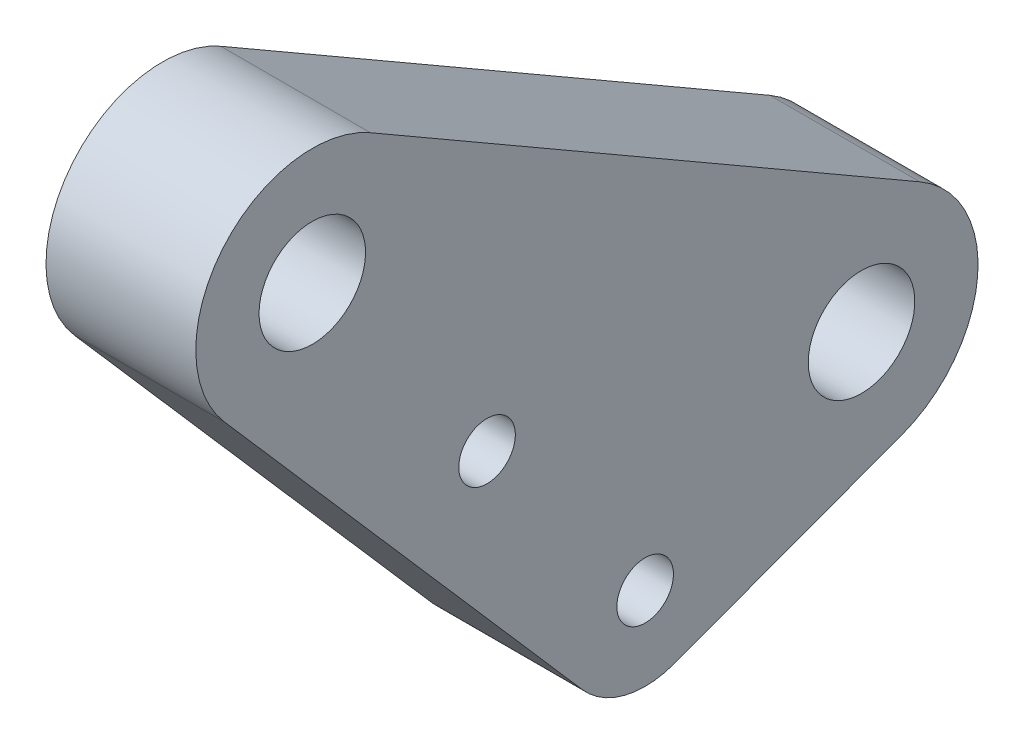
ISO-10303-21;
HEADER;
FILE_DESCRIPTION(('STEP AP214'),'2;1');
FILE_NAME('part.step','',(''),(''),'','','');
FILE_SCHEMA(('AUTOMOTIVE_DESIGN { 1 0 10303 214 1 1 1 1 }'));
ENDSEC;
DATA;
#1=APPLICATION_CONTEXT('core data for automotive mechanical design processes');
#2=APPLICATION_PROTOCOL_DEFINITION('international standard','automotive_design',2000,#1);
#3=PRODUCT_CONTEXT('',#1,'mechanical');
#4=PRODUCT('Part','Part','',(#3));
#5=PRODUCT_RELATED_PRODUCT_CATEGORY('part','',(#4));
#6=PRODUCT_DEFINITION_FORMATION('','',#4);
#7=PRODUCT_DEFINITION_CONTEXT('part definition',#1,'design');
#8=PRODUCT_DEFINITION('design','',#6,#7);
#9=PRODUCT_DEFINITION_SHAPE('','',#8);
#10=(LENGTH_UNIT() NAMED_UNIT(*) SI_UNIT(.MILLI.,.METRE.));
#11=(NAMED_UNIT(*) PLANE_ANGLE_UNIT() SI_UNIT($,.RADIAN.));
#12=(NAMED_UNIT(*) SI_UNIT($,.STERADIAN.) SOLID_ANGLE_UNIT());
#13=UNCERTAINTY_MEASURE_WITH_UNIT(LENGTH_MEASURE(1.E-05),#10,'distance_accuracy_value','');
#14=(GEOMETRIC_REPRESENTATION_CONTEXT(3) GLOBAL_UNCERTAINTY_ASSIGNED_CONTEXT((#13)) GLOBAL_UNIT_ASSIGNED_CONTEXT((#10,
#11,#12)) REPRESENTATION_CONTEXT('',''));
#15=CARTESIAN_POINT('',(0.,0.,0.));
#16=DIRECTION('',(0.,0.,1.));
#17=DIRECTION('',(1.,0.,0.));
#18=AXIS2_PLACEMENT_3D('',#15,#16,#17);
#19=CARTESIAN_POINT('',(0.,214.,0.));
#20=DIRECTION('',(1.,0.,0.));
#21=DIRECTION('',(0.,0.,-1.));
#22=AXIS2_PLACEMENT_3D('',#19,#20,#21);
#23=CYLINDRICAL_SURFACE('',#22,7.00000000000004);
#24=CARTESIAN_POINT('',(9.,214.,0.));
#25=DIRECTION('',(1.,0.,0.));
#26=DIRECTION('',(0.,0.,-1.));
#27=AXIS2_PLACEMENT_3D('',#24,#25,#26);
#28=CIRCLE('',#27,7.00000000000004);
#29=CARTESIAN_POINT('',(9.,207.43573664536,-2.43114101008833));
#30=VERTEX_POINT('',#29);
#31=CARTESIAN_POINT('',(9.,220.062177826491,-3.49999999999999));
#32=VERTEX_POINT('',#31);
#33=EDGE_CURVE('E116',#30,#32,#28,.T.);
#34=ORIENTED_EDGE('',*,*,#33,.F.);
#35=DIRECTION('',(1.,0.,0.));
#36=VECTOR('',#35,1.);
#37=CARTESIAN_POINT('',(0.,207.43573664536,-2.43114101008833));
#38=LINE('',#37,#36);
#39=CARTESIAN_POINT('',(0.,207.43573664536,-2.43114101008833));
#40=VERTEX_POINT('',#39);
#41=EDGE_CURVE('E11',#40,#30,#38,.T.);
#42=ORIENTED_EDGE('',*,*,#41,.F.);
#43=CARTESIAN_POINT('',(0.,214.,0.));
#44=DIRECTION('',(1.,0.,0.));
#45=DIRECTION('',(0.,0.,-1.));
#46=AXIS2_PLACEMENT_3D('',#43,#44,#45);
#47=CIRCLE('',#46,7.00000000000004);
#48=CARTESIAN_POINT('',(0.,220.062177826491,-3.49999999999999));
#49=VERTEX_POINT('',#48);
#50=EDGE_CURVE('E131',#40,#49,#47,.T.);
#51=ORIENTED_EDGE('',*,*,#50,.T.);
#52=DIRECTION('',(1.,0.,0.));
#53=VECTOR('',#52,1.);
#54=CARTESIAN_POINT('',(0.,220.062177826491,-3.49999999999999));
#55=LINE('',#54,#53);
#56=EDGE_CURVE('E34',#49,#32,#55,.T.);
#57=ORIENTED_EDGE('',*,*,#56,.T.);
#58=EDGE_LOOP('',(#34,#42,#51,#57));
#59=FACE_BOUND('',#58,.T.);
#60=ADVANCED_FACE('F31',(#59),#23,.T.);
#61=CARTESIAN_POINT('',(0.,202.363799344229,11.2634707070797));
#62=DIRECTION('',(0.,-0.937751907805683,-0.347305858584048));
#63=DIRECTION('',(0.,0.347305858584048,-0.937751907805683));
#64=AXIS2_PLACEMENT_3D('',#61,#62,#63);
#65=PLANE('',#64);
#66=DIRECTION('',(0.,0.347305858584048,-0.937751907805683));
#67=VECTOR('',#66,1.);
#68=CARTESIAN_POINT('',(9.,202.363799344229,11.2634707070797));
#69=LINE('',#68,#67);
#70=CARTESIAN_POINT('',(9.,202.363799344229,11.2634707070797));
#71=VERTEX_POINT('',#70);
#72=EDGE_CURVE('E129',#71,#30,#69,.T.);
#73=ORIENTED_EDGE('',*,*,#72,.F.);
#74=DIRECTION('',(1.,0.,0.));
#75=VECTOR('',#74,1.);
#76=CARTESIAN_POINT('',(0.,202.363799344229,11.2634707070797));
#77=LINE('',#76,#75);
#78=CARTESIAN_POINT('',(0.,202.363799344229,11.2634707070797));
#79=VERTEX_POINT('',#78);
#80=EDGE_CURVE('E40',#79,#71,#77,.T.);
#81=ORIENTED_EDGE('',*,*,#80,.F.);
#82=DIRECTION('',(0.,0.347305858584048,-0.937751907805683));
#83=VECTOR('',#82,1.);
#84=CARTESIAN_POINT('',(0.,202.363799344229,11.2634707070797));
#85=LINE('',#84,#83);
#86=EDGE_CURVE('E106',#79,#40,#85,.T.);
#87=ORIENTED_EDGE('',*,*,#86,.T.);
#88=ORIENTED_EDGE('',*,*,#41,.T.);
#89=EDGE_LOOP('',(#73,#81,#87,#88));
#90=FACE_BOUND('',#89,.T.);
#91=ADVANCED_FACE('F139',(#90),#65,.T.);
#92=CARTESIAN_POINT('',(0.,207.052558883258,12.9999999999999));
#93=DIRECTION('',(1.,0.,0.));
#94=DIRECTION('',(0.,0.,-1.));
#95=AXIS2_PLACEMENT_3D('',#92,#93,#94);
#96=CYLINDRICAL_SURFACE('',#95,5.);
#97=CARTESIAN_POINT('',(9.,207.052558883258,12.9999999999999));
#98=DIRECTION('',(1.,0.,0.));
#99=DIRECTION('',(0.,0.,-1.));
#100=AXIS2_PLACEMENT_3D('',#97,#98,#99);
#101=CIRCLE('',#100,5.);
#102=CARTESIAN_POINT('',(9.,203.768041124197,16.7698730867784));
#103=VERTEX_POINT('',#102);
#104=EDGE_CURVE('E93',#103,#71,#101,.T.);
#105=ORIENTED_EDGE('',*,*,#104,.F.);
#106=DIRECTION('',(1.,0.,0.));
#107=VECTOR('',#106,1.);
#108=CARTESIAN_POINT('',(0.,203.768041124197,16.7698730867784));
#109=LINE('',#108,#107);
#110=CARTESIAN_POINT('',(0.,203.768041124197,16.7698730867784));
#111=VERTEX_POINT('',#110);
#112=EDGE_CURVE('E88',#111,#103,#109,.T.);
#113=ORIENTED_EDGE('',*,*,#112,.F.);
#114=CARTESIAN_POINT('',(0.,207.052558883258,12.9999999999999));
#115=DIRECTION('',(1.,0.,0.));
#116=DIRECTION('',(0.,0.,-1.));
#117=AXIS2_PLACEMENT_3D('',#114,#115,#116);
#118=CIRCLE('',#117,5.);
#119=EDGE_CURVE('E91',#111,#79,#118,.T.);
#120=ORIENTED_EDGE('',*,*,#119,.T.);
#121=ORIENTED_EDGE('',*,*,#80,.T.);
#122=EDGE_LOOP('',(#105,#113,#120,#121));
#123=FACE_BOUND('',#122,.T.);
#124=ADVANCED_FACE('F90',(#123),#96,.T.);
#125=CARTESIAN_POINT('',(0.,228.454234020573,38.2778223214898));
#126=DIRECTION('',(0.,-0.656903551812078,0.753974617355701));
#127=DIRECTION('',(0.,-0.753974617355701,-0.656903551812078));
#128=AXIS2_PLACEMENT_3D('',#125,#126,#127);
#129=PLANE('',#128);
#130=DIRECTION('',(0.,-0.753974617355701,-0.656903551812078));
#131=VECTOR('',#130,1.);
#132=CARTESIAN_POINT('',(9.,228.454234020573,38.2778223214898));
#133=LINE('',#132,#131);
#134=CARTESIAN_POINT('',(9.,228.454234020573,38.2778223214898));
#135=VERTEX_POINT('',#134);
#136=EDGE_CURVE('E126',#135,#103,#133,.T.);
#137=ORIENTED_EDGE('',*,*,#136,.F.);
#138=DIRECTION('',(1.,0.,0.));
#139=VECTOR('',#138,1.);
#140=CARTESIAN_POINT('',(0.,228.454234020573,38.2778223214898));
#141=LINE('',#140,#139);
#142=CARTESIAN_POINT('',(0.,228.454234020573,38.2778223214898));
#143=VERTEX_POINT('',#142);
#144=EDGE_CURVE('E98',#143,#135,#141,.T.);
#145=ORIENTED_EDGE('',*,*,#144,.F.);
#146=DIRECTION('',(0.,-0.753974617355701,-0.656903551812078));
#147=VECTOR('',#146,1.);
#148=CARTESIAN_POINT('',(0.,228.454234020573,38.2778223214898));
#149=LINE('',#148,#147);
#150=EDGE_CURVE('E104',#143,#111,#149,.T.);
#151=ORIENTED_EDGE('',*,*,#150,.T.);
#152=ORIENTED_EDGE('',*,*,#112,.T.);
#153=EDGE_LOOP('',(#137,#145,#151,#152));
#154=FACE_BOUND('',#153,.T.);
#155=ADVANCED_FACE('F108',(#154),#129,.T.);
#156=CARTESIAN_POINT('',(0.,233.052558883258,33.));
#157=DIRECTION('',(1.,0.,0.));
#158=DIRECTION('',(0.,0.,-1.));
#159=AXIS2_PLACEMENT_3D('',#156,#157,#158);
#160=CYLINDRICAL_SURFACE('',#159,7.00000000000001);
#161=CARTESIAN_POINT('',(9.,233.052558883258,33.));
#162=DIRECTION('',(1.,0.,0.));
#163=DIRECTION('',(0.,0.,-1.));
#164=AXIS2_PLACEMENT_3D('',#161,#162,#163);
#165=CIRCLE('',#164,7.00000000000001);
#166=CARTESIAN_POINT('',(9.,239.114736709749,29.4999999999999));
#167=VERTEX_POINT('',#166);
#168=EDGE_CURVE('E123',#167,#135,#165,.T.);
#169=ORIENTED_EDGE('',*,*,#168,.F.);
#170=DIRECTION('',(1.,0.,0.));
#171=VECTOR('',#170,1.);
#172=CARTESIAN_POINT('',(0.,239.114736709749,29.4999999999999));
#173=LINE('',#172,#171);
#174=CARTESIAN_POINT('',(0.,239.114736709749,29.4999999999999));
#175=VERTEX_POINT('',#174);
#176=EDGE_CURVE('E134',#175,#167,#173,.T.);
#177=ORIENTED_EDGE('',*,*,#176,.F.);
#178=CARTESIAN_POINT('',(0.,233.052558883258,33.));
#179=DIRECTION('',(1.,0.,0.));
#180=DIRECTION('',(0.,0.,-1.));
#181=AXIS2_PLACEMENT_3D('',#178,#179,#180);
#182=CIRCLE('',#181,7.00000000000001);
#183=EDGE_CURVE('E109',#175,#143,#182,.T.);
#184=ORIENTED_EDGE('',*,*,#183,.T.);
#185=ORIENTED_EDGE('',*,*,#144,.T.);
#186=EDGE_LOOP('',(#169,#177,#184,#185));
#187=FACE_BOUND('',#186,.T.);
#188=ADVANCED_FACE('F152',(#187),#160,.T.);
#189=CARTESIAN_POINT('',(0.,220.062177826491,-3.49999999999999));
#190=DIRECTION('',(0.,0.866025403784436,-0.500000000000004));
#191=DIRECTION('',(0.,0.500000000000004,0.866025403784436));
#192=AXIS2_PLACEMENT_3D('',#189,#190,#191);
#193=PLANE('',#192);
#194=DIRECTION('',(0.,0.500000000000004,0.866025403784436));
#195=VECTOR('',#194,1.);
#196=CARTESIAN_POINT('',(9.,220.062177826491,-3.49999999999999));
#197=LINE('',#196,#195);
#198=EDGE_CURVE('E119',#32,#167,#197,.T.);
#199=ORIENTED_EDGE('',*,*,#198,.F.);
#200=ORIENTED_EDGE('',*,*,#56,.F.);
#201=DIRECTION('',(0.,0.500000000000004,0.866025403784436));
#202=VECTOR('',#201,1.);
#203=CARTESIAN_POINT('',(0.,220.062177826491,-3.49999999999999));
#204=LINE('',#203,#202);
#205=EDGE_CURVE('E111',#49,#175,#204,.T.);
#206=ORIENTED_EDGE('',*,*,#205,.T.);
#207=ORIENTED_EDGE('',*,*,#176,.T.);
#208=EDGE_LOOP('',(#199,#200,#206,#207));
#209=FACE_BOUND('',#208,.T.);
#210=ADVANCED_FACE('F136',(#209),#193,.T.);
#211=CARTESIAN_POINT('',(0.,214.,0.));
#212=DIRECTION('',(1.,0.,0.));
#213=DIRECTION('',(0.,0.,-1.));
#214=AXIS2_PLACEMENT_3D('',#211,#212,#213);
#215=PLANE('',#214);
#216=CARTESIAN_POINT('',(0.,219.052558883258,22.5000000000002));
#217=DIRECTION('',(1.,0.,0.));
#218=DIRECTION('',(0.,0.,1.));
#219=AXIS2_PLACEMENT_3D('',#216,#217,#218);
#220=CIRCLE('',#219,1.70000000000001);
#221=CARTESIAN_POINT('',(0.,219.052558883258,24.2000000000002));
#222=VERTEX_POINT('',#221);
#223=EDGE_CURVE('E186',#222,#222,#220,.T.);
#224=ORIENTED_EDGE('',*,*,#223,.T.);
#225=EDGE_LOOP('',(#224));
#226=FACE_BOUND('',#225,.T.);
#227=CARTESIAN_POINT('',(0.,233.052558883258,33.));
#228=DIRECTION('',(1.,0.,0.));
#229=DIRECTION('',(0.,0.,1.));
#230=AXIS2_PLACEMENT_3D('',#227,#228,#229);
#231=CIRCLE('',#230,3.20000000000001);
#232=CARTESIAN_POINT('',(0.,233.052558883258,36.2));
#233=VERTEX_POINT('',#232);
#234=EDGE_CURVE('E194',#233,#233,#231,.T.);
#235=ORIENTED_EDGE('',*,*,#234,.T.);
#236=EDGE_LOOP('',(#235));
#237=FACE_BOUND('',#236,.T.);
#238=CARTESIAN_POINT('',(0.,214.,0.));
#239=DIRECTION('',(1.,0.,0.));
#240=DIRECTION('',(0.,0.,1.));
#241=AXIS2_PLACEMENT_3D('',#238,#239,#240);
#242=CIRCLE('',#241,3.20000000000001);
#243=CARTESIAN_POINT('',(0.,214.,3.20000000000002));
#244=VERTEX_POINT('',#243);
#245=EDGE_CURVE('E200',#244,#244,#242,.T.);
#246=ORIENTED_EDGE('',*,*,#245,.T.);
#247=EDGE_LOOP('',(#246));
#248=FACE_BOUND('',#247,.T.);
#249=CARTESIAN_POINT('',(0.,207.052558883258,12.9999999999999));
#250=DIRECTION('',(1.,0.,0.));
#251=DIRECTION('',(0.,0.,1.));
#252=AXIS2_PLACEMENT_3D('',#249,#250,#251);
#253=CIRCLE('',#252,1.70000000000001);
#254=CARTESIAN_POINT('',(0.,207.052558883258,14.6999999999999));
#255=VERTEX_POINT('',#254);
#256=EDGE_CURVE('E120',#255,#255,#253,.T.);
#257=ORIENTED_EDGE('',*,*,#256,.T.);
#258=EDGE_LOOP('',(#257));
#259=FACE_BOUND('',#258,.T.);
#260=ORIENTED_EDGE('',*,*,#50,.F.);
#261=ORIENTED_EDGE('',*,*,#86,.F.);
#262=ORIENTED_EDGE('',*,*,#119,.F.);
#263=ORIENTED_EDGE('',*,*,#150,.F.);
#264=ORIENTED_EDGE('',*,*,#183,.F.);
#265=ORIENTED_EDGE('',*,*,#205,.F.);
#266=EDGE_LOOP('',(#260,#261,#262,#263,#264,#265));
#267=FACE_BOUND('',#266,.T.);
#268=ADVANCED_FACE('F102',(#226,#237,#248,#259,#267),#215,.F.);
#269=CARTESIAN_POINT('',(9.,214.,0.));
#270=DIRECTION('',(1.,0.,0.));
#271=DIRECTION('',(0.,0.,-1.));
#272=AXIS2_PLACEMENT_3D('',#269,#270,#271);
#273=PLANE('',#272);
#274=CARTESIAN_POINT('',(9.,219.052558883258,22.5000000000002));
#275=DIRECTION('',(1.,0.,0.));
#276=DIRECTION('',(0.,0.,1.));
#277=AXIS2_PLACEMENT_3D('',#274,#275,#276);
#278=CIRCLE('',#277,1.70000000000001);
#279=CARTESIAN_POINT('',(9.,219.052558883258,24.2000000000002));
#280=VERTEX_POINT('',#279);
#281=EDGE_CURVE('E189',#280,#280,#278,.T.);
#282=ORIENTED_EDGE('',*,*,#281,.F.);
#283=EDGE_LOOP('',(#282));
#284=FACE_BOUND('',#283,.T.);
#285=CARTESIAN_POINT('',(9.,233.052558883258,33.));
#286=DIRECTION('',(1.,0.,0.));
#287=DIRECTION('',(0.,0.,1.));
#288=AXIS2_PLACEMENT_3D('',#285,#286,#287);
#289=CIRCLE('',#288,3.20000000000001);
#290=CARTESIAN_POINT('',(9.,233.052558883258,36.2));
#291=VERTEX_POINT('',#290);
#292=EDGE_CURVE('E191',#291,#291,#289,.T.);
#293=ORIENTED_EDGE('',*,*,#292,.F.);
#294=EDGE_LOOP('',(#293));
#295=FACE_BOUND('',#294,.T.);
#296=CARTESIAN_POINT('',(9.,214.,0.));
#297=DIRECTION('',(1.,0.,0.));
#298=DIRECTION('',(0.,0.,1.));
#299=AXIS2_PLACEMENT_3D('',#296,#297,#298);
#300=CIRCLE('',#299,3.20000000000001);
#301=CARTESIAN_POINT('',(9.,214.,3.20000000000002));
#302=VERTEX_POINT('',#301);
#303=EDGE_CURVE('E197',#302,#302,#300,.T.);
#304=ORIENTED_EDGE('',*,*,#303,.F.);
#305=EDGE_LOOP('',(#304));
#306=FACE_BOUND('',#305,.T.);
#307=CARTESIAN_POINT('',(9.,207.052558883258,12.9999999999999));
#308=DIRECTION('',(1.,0.,0.));
#309=DIRECTION('',(0.,0.,1.));
#310=AXIS2_PLACEMENT_3D('',#307,#308,#309);
#311=CIRCLE('',#310,1.70000000000001);
#312=CARTESIAN_POINT('',(9.,207.052558883258,14.6999999999999));
#313=VERTEX_POINT('',#312);
#314=EDGE_CURVE('E203',#313,#313,#311,.T.);
#315=ORIENTED_EDGE('',*,*,#314,.F.);
#316=EDGE_LOOP('',(#315));
#317=FACE_BOUND('',#316,.T.);
#318=ORIENTED_EDGE('',*,*,#33,.T.);
#319=ORIENTED_EDGE('',*,*,#198,.T.);
#320=ORIENTED_EDGE('',*,*,#168,.T.);
#321=ORIENTED_EDGE('',*,*,#136,.T.);
#322=ORIENTED_EDGE('',*,*,#104,.T.);
#323=ORIENTED_EDGE('',*,*,#72,.T.);
#324=EDGE_LOOP('',(#318,#319,#320,#321,#322,#323));
#325=FACE_BOUND('',#324,.T.);
#326=ADVANCED_FACE('F138',(#284,#295,#306,#317,#325),#273,.T.);
#327=CARTESIAN_POINT('',(0.,207.052558883258,12.9999999999999));
#328=DIRECTION('',(1.,0.,0.));
#329=DIRECTION('',(0.,0.,-1.));
#330=AXIS2_PLACEMENT_3D('',#327,#328,#329);
#331=CYLINDRICAL_SURFACE('',#330,1.70000000000001);
#332=ORIENTED_EDGE('',*,*,#256,.F.);
#333=EDGE_LOOP('',(#332));
#334=FACE_BOUND('',#333,.T.);
#335=ORIENTED_EDGE('',*,*,#314,.T.);
#336=EDGE_LOOP('',(#335));
#337=FACE_BOUND('',#336,.T.);
#338=ADVANCED_FACE('F163',(#334,#337),#331,.F.);
#339=CARTESIAN_POINT('',(0.,214.,0.));
#340=DIRECTION('',(1.,0.,0.));
#341=DIRECTION('',(0.,0.,-1.));
#342=AXIS2_PLACEMENT_3D('',#339,#340,#341);
#343=CYLINDRICAL_SURFACE('',#342,3.20000000000001);
#344=ORIENTED_EDGE('',*,*,#245,.F.);
#345=EDGE_LOOP('',(#344));
#346=FACE_BOUND('',#345,.T.);
#347=ORIENTED_EDGE('',*,*,#303,.T.);
#348=EDGE_LOOP('',(#347));
#349=FACE_BOUND('',#348,.T.);
#350=ADVANCED_FACE('F170',(#346,#349),#343,.F.);
#351=CARTESIAN_POINT('',(0.,233.052558883258,33.));
#352=DIRECTION('',(1.,0.,0.));
#353=DIRECTION('',(0.,0.,-1.));
#354=AXIS2_PLACEMENT_3D('',#351,#352,#353);
#355=CYLINDRICAL_SURFACE('',#354,3.20000000000001);
#356=ORIENTED_EDGE('',*,*,#234,.F.);
#357=EDGE_LOOP('',(#356));
#358=FACE_BOUND('',#357,.T.);
#359=ORIENTED_EDGE('',*,*,#292,.T.);
#360=EDGE_LOOP('',(#359));
#361=FACE_BOUND('',#360,.T.);
#362=ADVANCED_FACE('F174',(#358,#361),#355,.F.);
#363=CARTESIAN_POINT('',(0.,219.052558883258,22.5000000000002));
#364=DIRECTION('',(1.,0.,0.));
#365=DIRECTION('',(0.,0.,-1.));
#366=AXIS2_PLACEMENT_3D('',#363,#364,#365);
#367=CYLINDRICAL_SURFACE('',#366,1.70000000000001);
#368=ORIENTED_EDGE('',*,*,#223,.F.);
#369=EDGE_LOOP('',(#368));
#370=FACE_BOUND('',#369,.T.);
#371=ORIENTED_EDGE('',*,*,#281,.T.);
#372=EDGE_LOOP('',(#371));
#373=FACE_BOUND('',#372,.T.);
#374=ADVANCED_FACE('F178',(#370,#373),#367,.F.);
#375=CLOSED_SHELL('',(#60,#91,#124,#155,#188,#210,#268,#326,#338,#350,#362,#374));
#376=MANIFOLD_SOLID_BREP('B2',#375);
#377=ADVANCED_BREP_SHAPE_REPRESENTATION('',(#18,#376),#14);
#378=SHAPE_DEFINITION_REPRESENTATION(#9,#377);
ENDSEC;
END-ISO-10303-21;
